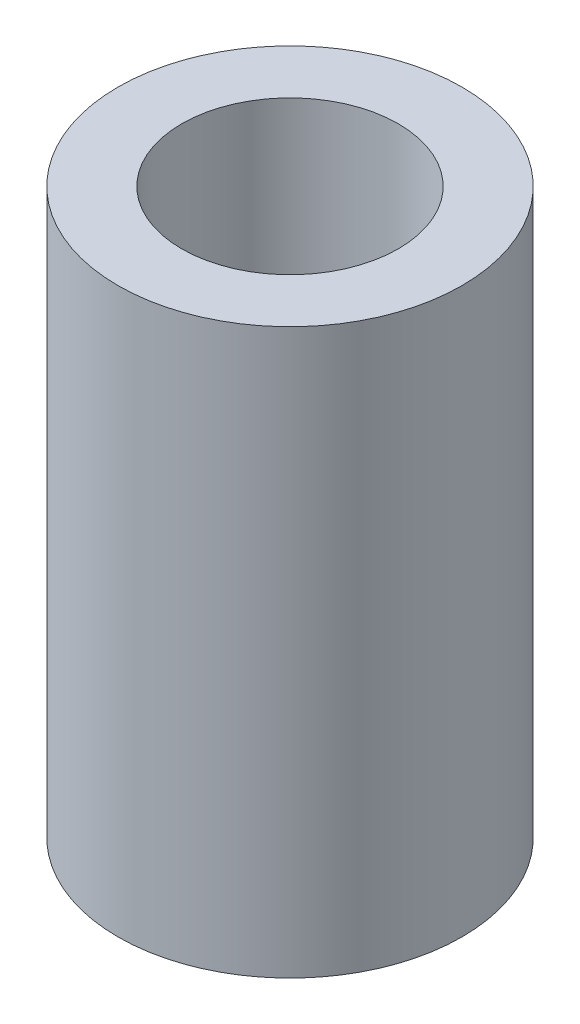
ISO-10303-21;
HEADER;
FILE_DESCRIPTION(('STEP AP214'),'2;1');
FILE_NAME('part.step','',(''),(''),'','','');
FILE_SCHEMA(('AUTOMOTIVE_DESIGN { 1 0 10303 214 1 1 1 1 }'));
ENDSEC;
DATA;
#1=APPLICATION_CONTEXT('core data for automotive mechanical design processes');
#2=APPLICATION_PROTOCOL_DEFINITION('international standard','automotive_design',2000,#1);
#3=PRODUCT_CONTEXT('',#1,'mechanical');
#4=PRODUCT('Part','Part','',(#3));
#5=PRODUCT_RELATED_PRODUCT_CATEGORY('part','',(#4));
#6=PRODUCT_DEFINITION_FORMATION('','',#4);
#7=PRODUCT_DEFINITION_CONTEXT('part definition',#1,'design');
#8=PRODUCT_DEFINITION('design','',#6,#7);
#9=PRODUCT_DEFINITION_SHAPE('','',#8);
#10=(LENGTH_UNIT() NAMED_UNIT(*) SI_UNIT(.MILLI.,.METRE.));
#11=(NAMED_UNIT(*) PLANE_ANGLE_UNIT() SI_UNIT($,.RADIAN.));
#12=(NAMED_UNIT(*) SI_UNIT($,.STERADIAN.) SOLID_ANGLE_UNIT());
#13=UNCERTAINTY_MEASURE_WITH_UNIT(LENGTH_MEASURE(1.E-05),#10,'distance_accuracy_value','');
#14=(GEOMETRIC_REPRESENTATION_CONTEXT(3) GLOBAL_UNCERTAINTY_ASSIGNED_CONTEXT((#13)) GLOBAL_UNIT_ASSIGNED_CONTEXT((#10,
#11,#12)) REPRESENTATION_CONTEXT('',''));
#15=CARTESIAN_POINT('',(0.,0.,0.));
#16=DIRECTION('',(0.,0.,1.));
#17=DIRECTION('',(1.,0.,0.));
#18=AXIS2_PLACEMENT_3D('',#15,#16,#17);
#19=CARTESIAN_POINT('',(0.,-10.414,0.));
#20=DIRECTION('',(0.,1.,0.));
#21=DIRECTION('',(0.,0.,1.));
#22=AXIS2_PLACEMENT_3D('',#19,#20,#21);
#23=CYLINDRICAL_SURFACE('',#22,3.175);
#24=CARTESIAN_POINT('',(0.,-10.414,0.));
#25=DIRECTION('',(0.,1.,0.));
#26=DIRECTION('',(0.,0.,1.));
#27=AXIS2_PLACEMENT_3D('',#24,#25,#26);
#28=CIRCLE('',#27,3.175);
#29=CARTESIAN_POINT('',(0.,-10.414,3.175));
#30=VERTEX_POINT('',#29);
#31=EDGE_CURVE('E10',#30,#30,#28,.T.);
#32=ORIENTED_EDGE('',*,*,#31,.T.);
#33=EDGE_LOOP('',(#32));
#34=FACE_BOUND('',#33,.T.);
#35=CARTESIAN_POINT('',(0.,0.,0.));
#36=DIRECTION('',(0.,1.,0.));
#37=DIRECTION('',(0.,0.,1.));
#38=AXIS2_PLACEMENT_3D('',#35,#36,#37);
#39=CIRCLE('',#38,3.175);
#40=CARTESIAN_POINT('',(0.,0.,3.175));
#41=VERTEX_POINT('',#40);
#42=EDGE_CURVE('E40',#41,#41,#39,.T.);
#43=ORIENTED_EDGE('',*,*,#42,.F.);
#44=EDGE_LOOP('',(#43));
#45=FACE_BOUND('',#44,.T.);
#46=ADVANCED_FACE('F37',(#34,#45),#23,.T.);
#47=CARTESIAN_POINT('',(0.,-10.414,0.));
#48=DIRECTION('',(0.,1.,0.));
#49=DIRECTION('',(0.,0.,1.));
#50=AXIS2_PLACEMENT_3D('',#47,#48,#49);
#51=PLANE('',#50);
#52=CARTESIAN_POINT('',(0.,-10.414,0.));
#53=DIRECTION('',(0.,1.,0.));
#54=DIRECTION('',(0.,0.,1.));
#55=AXIS2_PLACEMENT_3D('',#52,#53,#54);
#56=CIRCLE('',#55,2.);
#57=CARTESIAN_POINT('',(0.,-10.414,2.));
#58=VERTEX_POINT('',#57);
#59=EDGE_CURVE('E49',#58,#58,#56,.T.);
#60=ORIENTED_EDGE('',*,*,#59,.T.);
#61=EDGE_LOOP('',(#60));
#62=FACE_BOUND('',#61,.T.);
#63=ORIENTED_EDGE('',*,*,#31,.F.);
#64=EDGE_LOOP('',(#63));
#65=FACE_BOUND('',#64,.T.);
#66=ADVANCED_FACE('F59',(#62,#65),#51,.F.);
#67=CARTESIAN_POINT('',(0.,0.,0.));
#68=DIRECTION('',(0.,1.,0.));
#69=DIRECTION('',(0.,0.,1.));
#70=AXIS2_PLACEMENT_3D('',#67,#68,#69);
#71=PLANE('',#70);
#72=CARTESIAN_POINT('',(0.,0.,0.));
#73=DIRECTION('',(0.,1.,0.));
#74=DIRECTION('',(0.,0.,1.));
#75=AXIS2_PLACEMENT_3D('',#72,#73,#74);
#76=CIRCLE('',#75,2.);
#77=CARTESIAN_POINT('',(0.,0.,2.));
#78=VERTEX_POINT('',#77);
#79=EDGE_CURVE('E51',#78,#78,#76,.T.);
#80=ORIENTED_EDGE('',*,*,#79,.F.);
#81=EDGE_LOOP('',(#80));
#82=FACE_BOUND('',#81,.T.);
#83=ORIENTED_EDGE('',*,*,#42,.T.);
#84=EDGE_LOOP('',(#83));
#85=FACE_BOUND('',#84,.T.);
#86=ADVANCED_FACE('F65',(#82,#85),#71,.T.);
#87=CARTESIAN_POINT('',(0.,-10.414,0.));
#88=DIRECTION('',(0.,1.,0.));
#89=DIRECTION('',(0.,0.,1.));
#90=AXIS2_PLACEMENT_3D('',#87,#88,#89);
#91=CYLINDRICAL_SURFACE('',#90,2.);
#92=ORIENTED_EDGE('',*,*,#59,.F.);
#93=EDGE_LOOP('',(#92));
#94=FACE_BOUND('',#93,.T.);
#95=ORIENTED_EDGE('',*,*,#79,.T.);
#96=EDGE_LOOP('',(#95));
#97=FACE_BOUND('',#96,.T.);
#98=ADVANCED_FACE('F62',(#94,#97),#91,.F.);
#99=CLOSED_SHELL('',(#46,#66,#86,#98));
#100=MANIFOLD_SOLID_BREP('B2',#99);
#101=ADVANCED_BREP_SHAPE_REPRESENTATION('',(#18,#100),#14);
#102=SHAPE_DEFINITION_REPRESENTATION(#9,#101);
ENDSEC;
END-ISO-10303-21;
